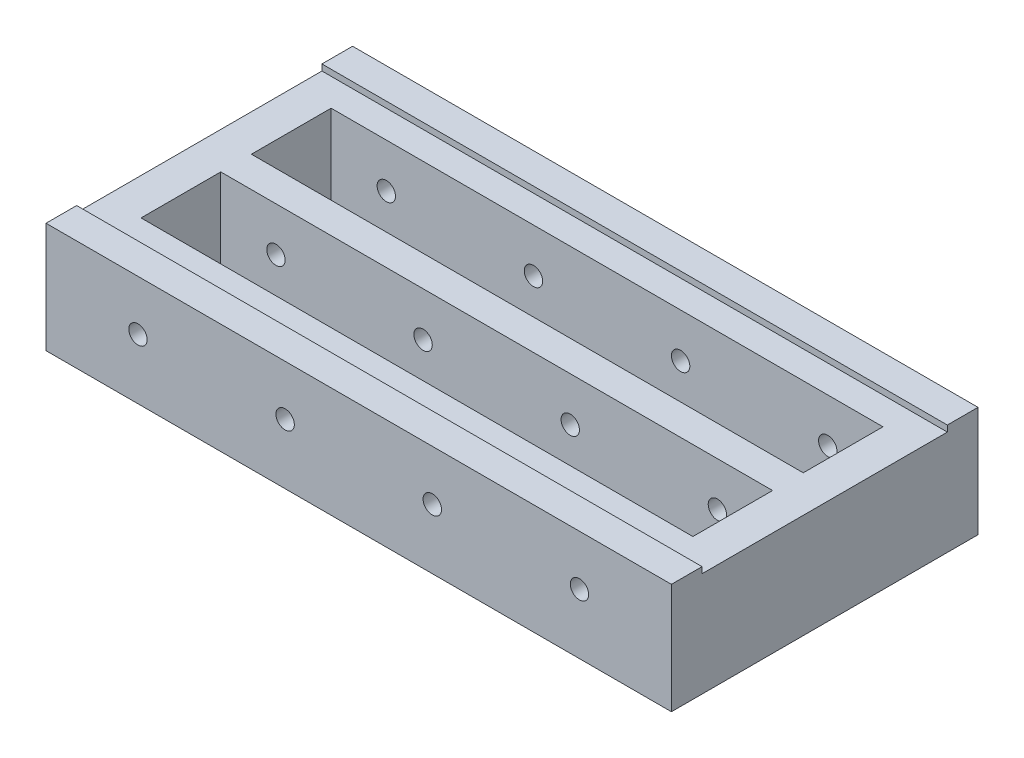
ISO-10303-21;
HEADER;
FILE_DESCRIPTION(('STEP AP214'),'2;1');
FILE_NAME('part.step','',(''),(''),'','','');
FILE_SCHEMA(('AUTOMOTIVE_DESIGN { 1 0 10303 214 1 1 1 1 }'));
ENDSEC;
DATA;
#1=APPLICATION_CONTEXT('core data for automotive mechanical design processes');
#2=APPLICATION_PROTOCOL_DEFINITION('international standard','automotive_design',2000,#1);
#3=PRODUCT_CONTEXT('',#1,'mechanical');
#4=PRODUCT('Part','Part','',(#3));
#5=PRODUCT_RELATED_PRODUCT_CATEGORY('part','',(#4));
#6=PRODUCT_DEFINITION_FORMATION('','',#4);
#7=PRODUCT_DEFINITION_CONTEXT('part definition',#1,'design');
#8=PRODUCT_DEFINITION('design','',#6,#7);
#9=PRODUCT_DEFINITION_SHAPE('','',#8);
#10=(LENGTH_UNIT() NAMED_UNIT(*) SI_UNIT(.MILLI.,.METRE.));
#11=(NAMED_UNIT(*) PLANE_ANGLE_UNIT() SI_UNIT($,.RADIAN.));
#12=(NAMED_UNIT(*) SI_UNIT($,.STERADIAN.) SOLID_ANGLE_UNIT());
#13=UNCERTAINTY_MEASURE_WITH_UNIT(LENGTH_MEASURE(1.E-05),#10,'distance_accuracy_value','');
#14=(GEOMETRIC_REPRESENTATION_CONTEXT(3) GLOBAL_UNCERTAINTY_ASSIGNED_CONTEXT((#13)) GLOBAL_UNIT_ASSIGNED_CONTEXT((#10,
#11,#12)) REPRESENTATION_CONTEXT('',''));
#15=CARTESIAN_POINT('',(0.,0.,0.));
#16=DIRECTION('',(0.,0.,1.));
#17=DIRECTION('',(1.,0.,0.));
#18=AXIS2_PLACEMENT_3D('',#15,#16,#17);
#19=CARTESIAN_POINT('',(0.,9.,0.));
#20=DIRECTION('',(0.,1.,0.));
#21=DIRECTION('',(0.,0.,1.));
#22=AXIS2_PLACEMENT_3D('',#19,#20,#21);
#23=PLANE('',#22);
#24=DIRECTION('',(-1.,0.,0.));
#25=VECTOR('',#24,1.);
#26=CARTESIAN_POINT('',(25.5,9.,-10.));
#27=LINE('',#26,#25);
#28=CARTESIAN_POINT('',(25.5,9.,-10.));
#29=VERTEX_POINT('',#28);
#30=CARTESIAN_POINT('',(-25.5,9.,-10.));
#31=VERTEX_POINT('',#30);
#32=EDGE_CURVE('E167',#29,#31,#27,.T.);
#33=ORIENTED_EDGE('',*,*,#32,.F.);
#34=DIRECTION('',(0.,0.,-1.));
#35=VECTOR('',#34,1.);
#36=CARTESIAN_POINT('',(25.5,9.,-12.5));
#37=LINE('',#36,#35);
#38=CARTESIAN_POINT('',(25.5,9.,-12.5));
#39=VERTEX_POINT('',#38);
#40=EDGE_CURVE('E243',#29,#39,#37,.T.);
#41=ORIENTED_EDGE('',*,*,#40,.T.);
#42=DIRECTION('',(-1.,0.,0.));
#43=VECTOR('',#42,1.);
#44=CARTESIAN_POINT('',(-25.5,9.,-12.5));
#45=LINE('',#44,#43);
#46=CARTESIAN_POINT('',(-25.5,9.,-12.5));
#47=VERTEX_POINT('',#46);
#48=EDGE_CURVE('E242',#39,#47,#45,.T.);
#49=ORIENTED_EDGE('',*,*,#48,.T.);
#50=DIRECTION('',(0.,0.,1.));
#51=VECTOR('',#50,1.);
#52=CARTESIAN_POINT('',(-25.5,9.,-12.5));
#53=LINE('',#52,#51);
#54=EDGE_CURVE('E245',#47,#31,#53,.T.);
#55=ORIENTED_EDGE('',*,*,#54,.T.);
#56=EDGE_LOOP('',(#33,#41,#49,#55));
#57=FACE_BOUND('',#56,.T.);
#58=ADVANCED_FACE('F40',(#57),#23,.T.);
#59=CARTESIAN_POINT('',(-22.5,9.,1.25));
#60=DIRECTION('',(1.,0.,0.));
#61=DIRECTION('',(0.,0.,-1.));
#62=AXIS2_PLACEMENT_3D('',#59,#60,#61);
#63=PLANE('',#62);
#64=DIRECTION('',(0.,-1.,0.));
#65=VECTOR('',#64,1.);
#66=CARTESIAN_POINT('',(-22.5,9.,1.25));
#67=LINE('',#66,#65);
#68=CARTESIAN_POINT('',(-22.5,8.5,1.25));
#69=VERTEX_POINT('',#68);
#70=CARTESIAN_POINT('',(-22.5,0.,1.25));
#71=VERTEX_POINT('',#70);
#72=EDGE_CURVE('E234',#69,#71,#67,.T.);
#73=ORIENTED_EDGE('',*,*,#72,.F.);
#74=DIRECTION('',(0.,0.,1.));
#75=VECTOR('',#74,1.);
#76=CARTESIAN_POINT('',(-22.5,8.5,1.25));
#77=LINE('',#76,#75);
#78=CARTESIAN_POINT('',(-22.5,8.5,7.75));
#79=VERTEX_POINT('',#78);
#80=EDGE_CURVE('E63',#69,#79,#77,.T.);
#81=ORIENTED_EDGE('',*,*,#80,.T.);
#82=DIRECTION('',(0.,-1.,0.));
#83=VECTOR('',#82,1.);
#84=CARTESIAN_POINT('',(-22.5,9.,7.75));
#85=LINE('',#84,#83);
#86=CARTESIAN_POINT('',(-22.5,0.,7.75));
#87=VERTEX_POINT('',#86);
#88=EDGE_CURVE('E236',#79,#87,#85,.T.);
#89=ORIENTED_EDGE('',*,*,#88,.T.);
#90=DIRECTION('',(0.,0.,1.));
#91=VECTOR('',#90,1.);
#92=CARTESIAN_POINT('',(-22.5,0.,1.25));
#93=LINE('',#92,#91);
#94=EDGE_CURVE('E226',#71,#87,#93,.T.);
#95=ORIENTED_EDGE('',*,*,#94,.F.);
#96=EDGE_LOOP('',(#73,#81,#89,#95));
#97=FACE_BOUND('',#96,.T.);
#98=ADVANCED_FACE('F303',(#97),#63,.T.);
#99=CARTESIAN_POINT('',(-22.5,9.,-7.75));
#100=DIRECTION('',(1.,0.,0.));
#101=DIRECTION('',(0.,0.,-1.));
#102=AXIS2_PLACEMENT_3D('',#99,#100,#101);
#103=PLANE('',#102);
#104=DIRECTION('',(0.,-1.,0.));
#105=VECTOR('',#104,1.);
#106=CARTESIAN_POINT('',(-22.5,9.,-7.75));
#107=LINE('',#106,#105);
#108=CARTESIAN_POINT('',(-22.5,8.5,-7.75));
#109=VERTEX_POINT('',#108);
#110=CARTESIAN_POINT('',(-22.5,0.,-7.75));
#111=VERTEX_POINT('',#110);
#112=EDGE_CURVE('E222',#109,#111,#107,.T.);
#113=ORIENTED_EDGE('',*,*,#112,.F.);
#114=DIRECTION('',(0.,0.,1.));
#115=VECTOR('',#114,1.);
#116=CARTESIAN_POINT('',(-22.5,8.5,-7.75));
#117=LINE('',#116,#115);
#118=CARTESIAN_POINT('',(-22.5,8.5,-1.25));
#119=VERTEX_POINT('',#118);
#120=EDGE_CURVE('E188',#109,#119,#117,.T.);
#121=ORIENTED_EDGE('',*,*,#120,.T.);
#122=DIRECTION('',(0.,-1.,0.));
#123=VECTOR('',#122,1.);
#124=CARTESIAN_POINT('',(-22.5,9.,-1.25));
#125=LINE('',#124,#123);
#126=CARTESIAN_POINT('',(-22.5,0.,-1.25));
#127=VERTEX_POINT('',#126);
#128=EDGE_CURVE('E224',#119,#127,#125,.T.);
#129=ORIENTED_EDGE('',*,*,#128,.T.);
#130=DIRECTION('',(0.,0.,1.));
#131=VECTOR('',#130,1.);
#132=CARTESIAN_POINT('',(-22.5,0.,-7.75));
#133=LINE('',#132,#131);
#134=EDGE_CURVE('E214',#111,#127,#133,.T.);
#135=ORIENTED_EDGE('',*,*,#134,.F.);
#136=EDGE_LOOP('',(#113,#121,#129,#135));
#137=FACE_BOUND('',#136,.T.);
#138=ADVANCED_FACE('F308',(#137),#103,.T.);
#139=CARTESIAN_POINT('',(13.5,9.,1.25));
#140=DIRECTION('',(0.,0.,1.));
#141=DIRECTION('',(1.,0.,0.));
#142=AXIS2_PLACEMENT_3D('',#139,#140,#141);
#143=PLANE('',#142);
#144=CARTESIAN_POINT('',(18.,4.9,1.25));
#145=DIRECTION('',(0.,0.,1.));
#146=DIRECTION('',(1.,0.,0.));
#147=AXIS2_PLACEMENT_3D('',#144,#145,#146);
#148=CIRCLE('',#147,0.750000000000002);
#149=CARTESIAN_POINT('',(18.75,4.9,1.25));
#150=VERTEX_POINT('',#149);
#151=EDGE_CURVE('E411',#150,#150,#148,.T.);
#152=ORIENTED_EDGE('',*,*,#151,.F.);
#153=EDGE_LOOP('',(#152));
#154=FACE_BOUND('',#153,.T.);
#155=DIRECTION('',(0.,-1.,0.));
#156=VECTOR('',#155,1.);
#157=CARTESIAN_POINT('',(22.5,9.,1.25));
#158=LINE('',#157,#156);
#159=CARTESIAN_POINT('',(22.5,8.5,1.25));
#160=VERTEX_POINT('',#159);
#161=CARTESIAN_POINT('',(22.5,0.,1.25));
#162=VERTEX_POINT('',#161);
#163=EDGE_CURVE('E208',#160,#162,#158,.T.);
#164=ORIENTED_EDGE('',*,*,#163,.F.);
#165=DIRECTION('',(-1.,0.,0.));
#166=VECTOR('',#165,1.);
#167=CARTESIAN_POINT('',(-22.5,8.5,1.25));
#168=LINE('',#167,#166);
#169=EDGE_CURVE('E191',#160,#69,#168,.T.);
#170=ORIENTED_EDGE('',*,*,#169,.T.);
#171=ORIENTED_EDGE('',*,*,#72,.T.);
#172=DIRECTION('',(-1.,0.,0.));
#173=VECTOR('',#172,1.);
#174=CARTESIAN_POINT('',(-22.5,0.,1.25));
#175=LINE('',#174,#173);
#176=EDGE_CURVE('E231',#162,#71,#175,.T.);
#177=ORIENTED_EDGE('',*,*,#176,.F.);
#178=EDGE_LOOP('',(#164,#170,#171,#177));
#179=FACE_BOUND('',#178,.T.);
#180=CARTESIAN_POINT('',(6.,4.9,1.25));
#181=DIRECTION('',(0.,0.,1.));
#182=DIRECTION('',(1.,0.,0.));
#183=AXIS2_PLACEMENT_3D('',#180,#181,#182);
#184=CIRCLE('',#183,0.750000000000002);
#185=CARTESIAN_POINT('',(6.75,4.9,1.25));
#186=VERTEX_POINT('',#185);
#187=EDGE_CURVE('E401',#186,#186,#184,.T.);
#188=ORIENTED_EDGE('',*,*,#187,.F.);
#189=EDGE_LOOP('',(#188));
#190=FACE_BOUND('',#189,.T.);
#191=CARTESIAN_POINT('',(-6.,4.9,1.25));
#192=DIRECTION('',(0.,0.,1.));
#193=DIRECTION('',(1.,0.,0.));
#194=AXIS2_PLACEMENT_3D('',#191,#192,#193);
#195=CIRCLE('',#194,0.750000000000002);
#196=CARTESIAN_POINT('',(-5.25,4.9,1.25));
#197=VERTEX_POINT('',#196);
#198=EDGE_CURVE('E391',#197,#197,#195,.T.);
#199=ORIENTED_EDGE('',*,*,#198,.F.);
#200=EDGE_LOOP('',(#199));
#201=FACE_BOUND('',#200,.T.);
#202=CARTESIAN_POINT('',(-18.,4.9,1.25));
#203=DIRECTION('',(0.,0.,1.));
#204=DIRECTION('',(1.,0.,0.));
#205=AXIS2_PLACEMENT_3D('',#202,#203,#204);
#206=CIRCLE('',#205,0.750000000000002);
#207=CARTESIAN_POINT('',(-17.25,4.9,1.25));
#208=VERTEX_POINT('',#207);
#209=EDGE_CURVE('E293',#208,#208,#206,.T.);
#210=ORIENTED_EDGE('',*,*,#209,.F.);
#211=EDGE_LOOP('',(#210));
#212=FACE_BOUND('',#211,.T.);
#213=ADVANCED_FACE('F344',(#154,#179,#190,#201,#212),#143,.T.);
#214=CARTESIAN_POINT('',(13.5,9.,7.75));
#215=DIRECTION('',(0.,0.,-1.));
#216=DIRECTION('',(-1.,0.,0.));
#217=AXIS2_PLACEMENT_3D('',#214,#215,#216);
#218=PLANE('',#217);
#219=CARTESIAN_POINT('',(18.,4.9,7.75));
#220=DIRECTION('',(0.,0.,-1.));
#221=DIRECTION('',(-1.,0.,0.));
#222=AXIS2_PLACEMENT_3D('',#219,#220,#221);
#223=CIRCLE('',#222,0.750000000000002);
#224=CARTESIAN_POINT('',(17.25,4.9,7.75));
#225=VERTEX_POINT('',#224);
#226=EDGE_CURVE('E414',#225,#225,#223,.T.);
#227=ORIENTED_EDGE('',*,*,#226,.F.);
#228=EDGE_LOOP('',(#227));
#229=FACE_BOUND('',#228,.T.);
#230=DIRECTION('',(0.,-1.,0.));
#231=VECTOR('',#230,1.);
#232=CARTESIAN_POINT('',(22.5,9.,7.75));
#233=LINE('',#232,#231);
#234=CARTESIAN_POINT('',(22.5,8.5,7.75));
#235=VERTEX_POINT('',#234);
#236=CARTESIAN_POINT('',(22.5,0.,7.75));
#237=VERTEX_POINT('',#236);
#238=EDGE_CURVE('E211',#235,#237,#233,.T.);
#239=ORIENTED_EDGE('',*,*,#238,.T.);
#240=DIRECTION('',(1.,0.,0.));
#241=VECTOR('',#240,1.);
#242=CARTESIAN_POINT('',(-22.5,0.,7.75));
#243=LINE('',#242,#241);
#244=EDGE_CURVE('E229',#87,#237,#243,.T.);
#245=ORIENTED_EDGE('',*,*,#244,.F.);
#246=ORIENTED_EDGE('',*,*,#88,.F.);
#247=DIRECTION('',(1.,0.,0.));
#248=VECTOR('',#247,1.);
#249=CARTESIAN_POINT('',(-22.5,8.5,7.75));
#250=LINE('',#249,#248);
#251=EDGE_CURVE('E193',#79,#235,#250,.T.);
#252=ORIENTED_EDGE('',*,*,#251,.T.);
#253=EDGE_LOOP('',(#239,#245,#246,#252));
#254=FACE_BOUND('',#253,.T.);
#255=CARTESIAN_POINT('',(6.,4.9,7.75));
#256=DIRECTION('',(0.,0.,-1.));
#257=DIRECTION('',(-1.,0.,0.));
#258=AXIS2_PLACEMENT_3D('',#255,#256,#257);
#259=CIRCLE('',#258,0.750000000000002);
#260=CARTESIAN_POINT('',(5.25,4.9,7.75));
#261=VERTEX_POINT('',#260);
#262=EDGE_CURVE('E404',#261,#261,#259,.T.);
#263=ORIENTED_EDGE('',*,*,#262,.F.);
#264=EDGE_LOOP('',(#263));
#265=FACE_BOUND('',#264,.T.);
#266=CARTESIAN_POINT('',(-6.,4.9,7.75));
#267=DIRECTION('',(0.,0.,-1.));
#268=DIRECTION('',(-1.,0.,0.));
#269=AXIS2_PLACEMENT_3D('',#266,#267,#268);
#270=CIRCLE('',#269,0.750000000000002);
#271=CARTESIAN_POINT('',(-6.75,4.9,7.75));
#272=VERTEX_POINT('',#271);
#273=EDGE_CURVE('E394',#272,#272,#270,.T.);
#274=ORIENTED_EDGE('',*,*,#273,.F.);
#275=EDGE_LOOP('',(#274));
#276=FACE_BOUND('',#275,.T.);
#277=CARTESIAN_POINT('',(-18.,4.9,7.75));
#278=DIRECTION('',(0.,0.,-1.));
#279=DIRECTION('',(-1.,0.,0.));
#280=AXIS2_PLACEMENT_3D('',#277,#278,#279);
#281=CIRCLE('',#280,0.750000000000002);
#282=CARTESIAN_POINT('',(-18.75,4.9,7.75));
#283=VERTEX_POINT('',#282);
#284=EDGE_CURVE('E289',#283,#283,#281,.T.);
#285=ORIENTED_EDGE('',*,*,#284,.F.);
#286=EDGE_LOOP('',(#285));
#287=FACE_BOUND('',#286,.T.);
#288=ADVANCED_FACE('F340',(#229,#254,#265,#276,#287),#218,.T.);
#289=CARTESIAN_POINT('',(22.5,9.,1.25));
#290=DIRECTION('',(-1.,0.,0.));
#291=DIRECTION('',(0.,0.,1.));
#292=AXIS2_PLACEMENT_3D('',#289,#290,#291);
#293=PLANE('',#292);
#294=ORIENTED_EDGE('',*,*,#238,.F.);
#295=DIRECTION('',(0.,0.,-1.));
#296=VECTOR('',#295,1.);
#297=CARTESIAN_POINT('',(22.5,8.5,1.25));
#298=LINE('',#297,#296);
#299=EDGE_CURVE('E182',#235,#160,#298,.T.);
#300=ORIENTED_EDGE('',*,*,#299,.T.);
#301=ORIENTED_EDGE('',*,*,#163,.T.);
#302=DIRECTION('',(0.,0.,-1.));
#303=VECTOR('',#302,1.);
#304=CARTESIAN_POINT('',(22.5,0.,1.25));
#305=LINE('',#304,#303);
#306=EDGE_CURVE('E205',#237,#162,#305,.T.);
#307=ORIENTED_EDGE('',*,*,#306,.F.);
#308=EDGE_LOOP('',(#294,#300,#301,#307));
#309=FACE_BOUND('',#308,.T.);
#310=ADVANCED_FACE('F336',(#309),#293,.T.);
#311=CARTESIAN_POINT('',(13.5,9.,-1.25));
#312=DIRECTION('',(0.,0.,-1.));
#313=DIRECTION('',(-1.,0.,0.));
#314=AXIS2_PLACEMENT_3D('',#311,#312,#313);
#315=PLANE('',#314);
#316=CARTESIAN_POINT('',(18.,4.9,-1.25));
#317=DIRECTION('',(0.,0.,-1.));
#318=DIRECTION('',(-1.,0.,0.));
#319=AXIS2_PLACEMENT_3D('',#316,#317,#318);
#320=CIRCLE('',#319,0.750000000000002);
#321=CARTESIAN_POINT('',(17.25,4.9,-1.25));
#322=VERTEX_POINT('',#321);
#323=EDGE_CURVE('E417',#322,#322,#320,.T.);
#324=ORIENTED_EDGE('',*,*,#323,.F.);
#325=EDGE_LOOP('',(#324));
#326=FACE_BOUND('',#325,.T.);
#327=DIRECTION('',(0.,-1.,0.));
#328=VECTOR('',#327,1.);
#329=CARTESIAN_POINT('',(22.5,9.,-1.25));
#330=LINE('',#329,#328);
#331=CARTESIAN_POINT('',(22.5,8.5,-1.25));
#332=VERTEX_POINT('',#331);
#333=CARTESIAN_POINT('',(22.5,0.,-1.25));
#334=VERTEX_POINT('',#333);
#335=EDGE_CURVE('E202',#332,#334,#330,.T.);
#336=ORIENTED_EDGE('',*,*,#335,.T.);
#337=DIRECTION('',(1.,0.,0.));
#338=VECTOR('',#337,1.);
#339=CARTESIAN_POINT('',(-22.5,0.,-1.25));
#340=LINE('',#339,#338);
#341=EDGE_CURVE('E217',#127,#334,#340,.T.);
#342=ORIENTED_EDGE('',*,*,#341,.F.);
#343=ORIENTED_EDGE('',*,*,#128,.F.);
#344=DIRECTION('',(1.,0.,0.));
#345=VECTOR('',#344,1.);
#346=CARTESIAN_POINT('',(-22.5,8.5,-1.25));
#347=LINE('',#346,#345);
#348=EDGE_CURVE('E186',#119,#332,#347,.T.);
#349=ORIENTED_EDGE('',*,*,#348,.T.);
#350=EDGE_LOOP('',(#336,#342,#343,#349));
#351=FACE_BOUND('',#350,.T.);
#352=CARTESIAN_POINT('',(6.,4.9,-1.25));
#353=DIRECTION('',(0.,0.,-1.));
#354=DIRECTION('',(-1.,0.,0.));
#355=AXIS2_PLACEMENT_3D('',#352,#353,#354);
#356=CIRCLE('',#355,0.750000000000002);
#357=CARTESIAN_POINT('',(5.25,4.9,-1.25));
#358=VERTEX_POINT('',#357);
#359=EDGE_CURVE('E369',#358,#358,#356,.T.);
#360=ORIENTED_EDGE('',*,*,#359,.F.);
#361=EDGE_LOOP('',(#360));
#362=FACE_BOUND('',#361,.T.);
#363=CARTESIAN_POINT('',(-6.,4.9,-1.25));
#364=DIRECTION('',(0.,0.,-1.));
#365=DIRECTION('',(-1.,0.,0.));
#366=AXIS2_PLACEMENT_3D('',#363,#364,#365);
#367=CIRCLE('',#366,0.750000000000002);
#368=CARTESIAN_POINT('',(-6.75,4.9,-1.25));
#369=VERTEX_POINT('',#368);
#370=EDGE_CURVE('E373',#369,#369,#367,.T.);
#371=ORIENTED_EDGE('',*,*,#370,.F.);
#372=EDGE_LOOP('',(#371));
#373=FACE_BOUND('',#372,.T.);
#374=CARTESIAN_POINT('',(-18.,4.9,-1.25));
#375=DIRECTION('',(0.,0.,-1.));
#376=DIRECTION('',(-1.,0.,0.));
#377=AXIS2_PLACEMENT_3D('',#374,#375,#376);
#378=CIRCLE('',#377,0.750000000000002);
#379=CARTESIAN_POINT('',(-18.75,4.9,-1.25));
#380=VERTEX_POINT('',#379);
#381=EDGE_CURVE('E376',#380,#380,#378,.T.);
#382=ORIENTED_EDGE('',*,*,#381,.F.);
#383=EDGE_LOOP('',(#382));
#384=FACE_BOUND('',#383,.T.);
#385=ADVANCED_FACE('F327',(#326,#351,#362,#373,#384),#315,.T.);
#386=CARTESIAN_POINT('',(22.5,9.,-7.75));
#387=DIRECTION('',(-1.,0.,0.));
#388=DIRECTION('',(0.,0.,1.));
#389=AXIS2_PLACEMENT_3D('',#386,#387,#388);
#390=PLANE('',#389);
#391=ORIENTED_EDGE('',*,*,#335,.F.);
#392=DIRECTION('',(0.,0.,-1.));
#393=VECTOR('',#392,1.);
#394=CARTESIAN_POINT('',(22.5,8.5,-7.75));
#395=LINE('',#394,#393);
#396=CARTESIAN_POINT('',(22.5,8.5,-7.75));
#397=VERTEX_POINT('',#396);
#398=EDGE_CURVE('E179',#332,#397,#395,.T.);
#399=ORIENTED_EDGE('',*,*,#398,.T.);
#400=DIRECTION('',(0.,-1.,0.));
#401=VECTOR('',#400,1.);
#402=CARTESIAN_POINT('',(22.5,9.,-7.75));
#403=LINE('',#402,#401);
#404=CARTESIAN_POINT('',(22.5,0.,-7.75));
#405=VERTEX_POINT('',#404);
#406=EDGE_CURVE('E199',#397,#405,#403,.T.);
#407=ORIENTED_EDGE('',*,*,#406,.T.);
#408=DIRECTION('',(0.,0.,-1.));
#409=VECTOR('',#408,1.);
#410=CARTESIAN_POINT('',(22.5,0.,-7.75));
#411=LINE('',#410,#409);
#412=EDGE_CURVE('E196',#334,#405,#411,.T.);
#413=ORIENTED_EDGE('',*,*,#412,.F.);
#414=EDGE_LOOP('',(#391,#399,#407,#413));
#415=FACE_BOUND('',#414,.T.);
#416=ADVANCED_FACE('F321',(#415),#390,.T.);
#417=CARTESIAN_POINT('',(13.5,9.,-7.75));
#418=DIRECTION('',(0.,0.,1.));
#419=DIRECTION('',(1.,0.,0.));
#420=AXIS2_PLACEMENT_3D('',#417,#418,#419);
#421=PLANE('',#420);
#422=CARTESIAN_POINT('',(18.,4.9,-7.75));
#423=DIRECTION('',(0.,0.,1.));
#424=DIRECTION('',(1.,0.,0.));
#425=AXIS2_PLACEMENT_3D('',#422,#423,#424);
#426=CIRCLE('',#425,0.750000000000002);
#427=CARTESIAN_POINT('',(18.75,4.9,-7.75));
#428=VERTEX_POINT('',#427);
#429=EDGE_CURVE('E420',#428,#428,#426,.T.);
#430=ORIENTED_EDGE('',*,*,#429,.F.);
#431=EDGE_LOOP('',(#430));
#432=FACE_BOUND('',#431,.T.);
#433=ORIENTED_EDGE('',*,*,#406,.F.);
#434=DIRECTION('',(-1.,0.,0.));
#435=VECTOR('',#434,1.);
#436=CARTESIAN_POINT('',(13.5,8.5,-7.75));
#437=LINE('',#436,#435);
#438=EDGE_CURVE('E11',#397,#109,#437,.T.);
#439=ORIENTED_EDGE('',*,*,#438,.T.);
#440=ORIENTED_EDGE('',*,*,#112,.T.);
#441=DIRECTION('',(-1.,0.,0.));
#442=VECTOR('',#441,1.);
#443=CARTESIAN_POINT('',(-22.5,0.,-7.75));
#444=LINE('',#443,#442);
#445=EDGE_CURVE('E219',#405,#111,#444,.T.);
#446=ORIENTED_EDGE('',*,*,#445,.F.);
#447=EDGE_LOOP('',(#433,#439,#440,#446));
#448=FACE_BOUND('',#447,.T.);
#449=CARTESIAN_POINT('',(6.,4.9,-7.75));
#450=DIRECTION('',(0.,0.,1.));
#451=DIRECTION('',(1.,0.,0.));
#452=AXIS2_PLACEMENT_3D('',#449,#450,#451);
#453=CIRCLE('',#452,0.750000000000002);
#454=CARTESIAN_POINT('',(6.75,4.9,-7.75));
#455=VERTEX_POINT('',#454);
#456=EDGE_CURVE('E408',#455,#455,#453,.T.);
#457=ORIENTED_EDGE('',*,*,#456,.F.);
#458=EDGE_LOOP('',(#457));
#459=FACE_BOUND('',#458,.T.);
#460=CARTESIAN_POINT('',(-6.,4.9,-7.75));
#461=DIRECTION('',(0.,0.,1.));
#462=DIRECTION('',(1.,0.,0.));
#463=AXIS2_PLACEMENT_3D('',#460,#461,#462);
#464=CIRCLE('',#463,0.750000000000002);
#465=CARTESIAN_POINT('',(-5.25,4.9,-7.75));
#466=VERTEX_POINT('',#465);
#467=EDGE_CURVE('E398',#466,#466,#464,.T.);
#468=ORIENTED_EDGE('',*,*,#467,.F.);
#469=EDGE_LOOP('',(#468));
#470=FACE_BOUND('',#469,.T.);
#471=CARTESIAN_POINT('',(-18.,4.9,-7.75));
#472=DIRECTION('',(0.,0.,1.));
#473=DIRECTION('',(1.,0.,0.));
#474=AXIS2_PLACEMENT_3D('',#471,#472,#473);
#475=CIRCLE('',#474,0.750000000000002);
#476=CARTESIAN_POINT('',(-17.25,4.9,-7.75));
#477=VERTEX_POINT('',#476);
#478=EDGE_CURVE('E378',#477,#477,#475,.T.);
#479=ORIENTED_EDGE('',*,*,#478,.F.);
#480=EDGE_LOOP('',(#479));
#481=FACE_BOUND('',#480,.T.);
#482=ADVANCED_FACE('F313',(#432,#448,#459,#470,#481),#421,.T.);
#483=DIRECTION('',(1.,0.,0.));
#484=VECTOR('',#483,1.);
#485=CARTESIAN_POINT('',(25.5,9.,10.));
#486=LINE('',#485,#484);
#487=CARTESIAN_POINT('',(-25.5,9.,10.));
#488=VERTEX_POINT('',#487);
#489=CARTESIAN_POINT('',(25.5,9.,10.));
#490=VERTEX_POINT('',#489);
#491=EDGE_CURVE('E288',#488,#490,#486,.T.);
#492=ORIENTED_EDGE('',*,*,#491,.F.);
#493=CARTESIAN_POINT('',(-25.5,9.,12.5));
#494=VERTEX_POINT('',#493);
#495=EDGE_CURVE('E172',#488,#494,#53,.T.);
#496=ORIENTED_EDGE('',*,*,#495,.T.);
#497=DIRECTION('',(1.,0.,0.));
#498=VECTOR('',#497,1.);
#499=CARTESIAN_POINT('',(-25.5,9.,12.5));
#500=LINE('',#499,#498);
#501=CARTESIAN_POINT('',(25.5,9.,12.5));
#502=VERTEX_POINT('',#501);
#503=EDGE_CURVE('E248',#494,#502,#500,.T.);
#504=ORIENTED_EDGE('',*,*,#503,.T.);
#505=EDGE_CURVE('E239',#502,#490,#37,.T.);
#506=ORIENTED_EDGE('',*,*,#505,.T.);
#507=EDGE_LOOP('',(#492,#496,#504,#506));
#508=FACE_BOUND('',#507,.T.);
#509=ADVANCED_FACE('F287',(#508),#23,.T.);
#510=CARTESIAN_POINT('',(0.,0.,0.));
#511=DIRECTION('',(0.,1.,0.));
#512=DIRECTION('',(0.,0.,1.));
#513=AXIS2_PLACEMENT_3D('',#510,#511,#512);
#514=PLANE('',#513);
#515=ORIENTED_EDGE('',*,*,#244,.T.);
#516=ORIENTED_EDGE('',*,*,#306,.T.);
#517=ORIENTED_EDGE('',*,*,#176,.T.);
#518=ORIENTED_EDGE('',*,*,#94,.T.);
#519=EDGE_LOOP('',(#515,#516,#517,#518));
#520=FACE_BOUND('',#519,.T.);
#521=DIRECTION('',(0.,0.,-1.));
#522=VECTOR('',#521,1.);
#523=CARTESIAN_POINT('',(25.5,0.,-12.5));
#524=LINE('',#523,#522);
#525=CARTESIAN_POINT('',(25.5,0.,12.5));
#526=VERTEX_POINT('',#525);
#527=CARTESIAN_POINT('',(25.5,0.,-12.5));
#528=VERTEX_POINT('',#527);
#529=EDGE_CURVE('E238',#526,#528,#524,.T.);
#530=ORIENTED_EDGE('',*,*,#529,.F.);
#531=DIRECTION('',(1.,0.,0.));
#532=VECTOR('',#531,1.);
#533=CARTESIAN_POINT('',(-25.5,0.,12.5));
#534=LINE('',#533,#532);
#535=CARTESIAN_POINT('',(-25.5,0.,12.5));
#536=VERTEX_POINT('',#535);
#537=EDGE_CURVE('E257',#536,#526,#534,.T.);
#538=ORIENTED_EDGE('',*,*,#537,.F.);
#539=DIRECTION('',(0.,0.,1.));
#540=VECTOR('',#539,1.);
#541=CARTESIAN_POINT('',(-25.5,0.,-12.5));
#542=LINE('',#541,#540);
#543=CARTESIAN_POINT('',(-25.5,0.,-12.5));
#544=VERTEX_POINT('',#543);
#545=EDGE_CURVE('E255',#544,#536,#542,.T.);
#546=ORIENTED_EDGE('',*,*,#545,.F.);
#547=DIRECTION('',(-1.,0.,0.));
#548=VECTOR('',#547,1.);
#549=CARTESIAN_POINT('',(-25.5,0.,-12.5));
#550=LINE('',#549,#548);
#551=EDGE_CURVE('E253',#528,#544,#550,.T.);
#552=ORIENTED_EDGE('',*,*,#551,.F.);
#553=EDGE_LOOP('',(#530,#538,#546,#552));
#554=FACE_BOUND('',#553,.T.);
#555=ORIENTED_EDGE('',*,*,#412,.T.);
#556=ORIENTED_EDGE('',*,*,#445,.T.);
#557=ORIENTED_EDGE('',*,*,#134,.T.);
#558=ORIENTED_EDGE('',*,*,#341,.T.);
#559=EDGE_LOOP('',(#555,#556,#557,#558));
#560=FACE_BOUND('',#559,.T.);
#561=ADVANCED_FACE('F279',(#520,#554,#560),#514,.F.);
#562=CARTESIAN_POINT('',(25.5,9.,-12.5));
#563=DIRECTION('',(-1.,0.,0.));
#564=DIRECTION('',(0.,0.,1.));
#565=AXIS2_PLACEMENT_3D('',#562,#563,#564);
#566=PLANE('',#565);
#567=ORIENTED_EDGE('',*,*,#40,.F.);
#568=DIRECTION('',(0.,1.,0.));
#569=VECTOR('',#568,1.);
#570=CARTESIAN_POINT('',(25.5,8.5,-10.));
#571=LINE('',#570,#569);
#572=CARTESIAN_POINT('',(25.5,8.5,-10.));
#573=VERTEX_POINT('',#572);
#574=EDGE_CURVE('E174',#573,#29,#571,.T.);
#575=ORIENTED_EDGE('',*,*,#574,.F.);
#576=DIRECTION('',(0.,0.,-1.));
#577=VECTOR('',#576,1.);
#578=CARTESIAN_POINT('',(25.5,8.5,10.));
#579=LINE('',#578,#577);
#580=CARTESIAN_POINT('',(25.5,8.5,10.));
#581=VERTEX_POINT('',#580);
#582=EDGE_CURVE('E160',#581,#573,#579,.T.);
#583=ORIENTED_EDGE('',*,*,#582,.F.);
#584=DIRECTION('',(0.,1.,0.));
#585=VECTOR('',#584,1.);
#586=CARTESIAN_POINT('',(25.5,8.5,10.));
#587=LINE('',#586,#585);
#588=EDGE_CURVE('E158',#581,#490,#587,.T.);
#589=ORIENTED_EDGE('',*,*,#588,.T.);
#590=ORIENTED_EDGE('',*,*,#505,.F.);
#591=DIRECTION('',(0.,-1.,0.));
#592=VECTOR('',#591,1.);
#593=CARTESIAN_POINT('',(25.5,9.,12.5));
#594=LINE('',#593,#592);
#595=EDGE_CURVE('E250',#502,#526,#594,.T.);
#596=ORIENTED_EDGE('',*,*,#595,.T.);
#597=ORIENTED_EDGE('',*,*,#529,.T.);
#598=DIRECTION('',(0.,-1.,0.));
#599=VECTOR('',#598,1.);
#600=CARTESIAN_POINT('',(25.5,9.,-12.5));
#601=LINE('',#600,#599);
#602=EDGE_CURVE('E48',#39,#528,#601,.T.);
#603=ORIENTED_EDGE('',*,*,#602,.F.);
#604=EDGE_LOOP('',(#567,#575,#583,#589,#590,#596,#597,#603));
#605=FACE_BOUND('',#604,.T.);
#606=ADVANCED_FACE('F42',(#605),#566,.F.);
#607=CARTESIAN_POINT('',(-25.5,9.,-12.5));
#608=DIRECTION('',(0.,0.,1.));
#609=DIRECTION('',(1.,0.,0.));
#610=AXIS2_PLACEMENT_3D('',#607,#608,#609);
#611=PLANE('',#610);
#612=CARTESIAN_POINT('',(-6.,4.9,-12.5));
#613=DIRECTION('',(0.,0.,1.));
#614=DIRECTION('',(1.,0.,0.));
#615=AXIS2_PLACEMENT_3D('',#612,#613,#614);
#616=CIRCLE('',#615,0.750000000000002);
#617=CARTESIAN_POINT('',(-5.25,4.9,-12.5));
#618=VERTEX_POINT('',#617);
#619=EDGE_CURVE('E423',#618,#618,#616,.T.);
#620=ORIENTED_EDGE('',*,*,#619,.T.);
#621=EDGE_LOOP('',(#620));
#622=FACE_BOUND('',#621,.T.);
#623=CARTESIAN_POINT('',(6.,4.9,-12.5));
#624=DIRECTION('',(0.,0.,1.));
#625=DIRECTION('',(1.,0.,0.));
#626=AXIS2_PLACEMENT_3D('',#623,#624,#625);
#627=CIRCLE('',#626,0.750000000000002);
#628=CARTESIAN_POINT('',(6.75,4.9,-12.5));
#629=VERTEX_POINT('',#628);
#630=EDGE_CURVE('E431',#629,#629,#627,.T.);
#631=ORIENTED_EDGE('',*,*,#630,.T.);
#632=EDGE_LOOP('',(#631));
#633=FACE_BOUND('',#632,.T.);
#634=CARTESIAN_POINT('',(18.,4.9,-12.5));
#635=DIRECTION('',(0.,0.,1.));
#636=DIRECTION('',(1.,0.,0.));
#637=AXIS2_PLACEMENT_3D('',#634,#635,#636);
#638=CIRCLE('',#637,0.750000000000002);
#639=CARTESIAN_POINT('',(18.75,4.9,-12.5));
#640=VERTEX_POINT('',#639);
#641=EDGE_CURVE('E424',#640,#640,#638,.T.);
#642=ORIENTED_EDGE('',*,*,#641,.T.);
#643=EDGE_LOOP('',(#642));
#644=FACE_BOUND('',#643,.T.);
#645=CARTESIAN_POINT('',(-18.,4.9,-12.5));
#646=DIRECTION('',(0.,0.,1.));
#647=DIRECTION('',(1.,0.,0.));
#648=AXIS2_PLACEMENT_3D('',#645,#646,#647);
#649=CIRCLE('',#648,0.750000000000002);
#650=CARTESIAN_POINT('',(-17.25,4.9,-12.5));
#651=VERTEX_POINT('',#650);
#652=EDGE_CURVE('E383',#651,#651,#649,.T.);
#653=ORIENTED_EDGE('',*,*,#652,.T.);
#654=EDGE_LOOP('',(#653));
#655=FACE_BOUND('',#654,.T.);
#656=ORIENTED_EDGE('',*,*,#551,.T.);
#657=DIRECTION('',(0.,-1.,0.));
#658=VECTOR('',#657,1.);
#659=CARTESIAN_POINT('',(-25.5,9.,-12.5));
#660=LINE('',#659,#658);
#661=EDGE_CURVE('E264',#47,#544,#660,.T.);
#662=ORIENTED_EDGE('',*,*,#661,.F.);
#663=ORIENTED_EDGE('',*,*,#48,.F.);
#664=ORIENTED_EDGE('',*,*,#602,.T.);
#665=EDGE_LOOP('',(#656,#662,#663,#664));
#666=FACE_BOUND('',#665,.T.);
#667=ADVANCED_FACE('F270',(#622,#633,#644,#655,#666),#611,.F.);
#668=CARTESIAN_POINT('',(-25.5,9.,-12.5));
#669=DIRECTION('',(1.,0.,0.));
#670=DIRECTION('',(0.,0.,-1.));
#671=AXIS2_PLACEMENT_3D('',#668,#669,#670);
#672=PLANE('',#671);
#673=DIRECTION('',(0.,0.,1.));
#674=VECTOR('',#673,1.);
#675=CARTESIAN_POINT('',(-25.5,8.5,10.));
#676=LINE('',#675,#674);
#677=CARTESIAN_POINT('',(-25.5,8.5,-10.));
#678=VERTEX_POINT('',#677);
#679=CARTESIAN_POINT('',(-25.5,8.5,10.));
#680=VERTEX_POINT('',#679);
#681=EDGE_CURVE('E161',#678,#680,#676,.T.);
#682=ORIENTED_EDGE('',*,*,#681,.F.);
#683=DIRECTION('',(0.,1.,0.));
#684=VECTOR('',#683,1.);
#685=CARTESIAN_POINT('',(-25.5,8.5,-10.));
#686=LINE('',#685,#684);
#687=EDGE_CURVE('E183',#678,#31,#686,.T.);
#688=ORIENTED_EDGE('',*,*,#687,.T.);
#689=ORIENTED_EDGE('',*,*,#54,.F.);
#690=ORIENTED_EDGE('',*,*,#661,.T.);
#691=ORIENTED_EDGE('',*,*,#545,.T.);
#692=DIRECTION('',(0.,-1.,0.));
#693=VECTOR('',#692,1.);
#694=CARTESIAN_POINT('',(-25.5,9.,12.5));
#695=LINE('',#694,#693);
#696=EDGE_CURVE('E261',#494,#536,#695,.T.);
#697=ORIENTED_EDGE('',*,*,#696,.F.);
#698=ORIENTED_EDGE('',*,*,#495,.F.);
#699=DIRECTION('',(0.,1.,0.));
#700=VECTOR('',#699,1.);
#701=CARTESIAN_POINT('',(-25.5,8.5,10.));
#702=LINE('',#701,#700);
#703=EDGE_CURVE('E155',#680,#488,#702,.T.);
#704=ORIENTED_EDGE('',*,*,#703,.F.);
#705=EDGE_LOOP('',(#682,#688,#689,#690,#691,#697,#698,#704));
#706=FACE_BOUND('',#705,.T.);
#707=ADVANCED_FACE('F170',(#706),#672,.F.);
#708=CARTESIAN_POINT('',(-25.5,9.,12.5));
#709=DIRECTION('',(0.,0.,-1.));
#710=DIRECTION('',(-1.,0.,0.));
#711=AXIS2_PLACEMENT_3D('',#708,#709,#710);
#712=PLANE('',#711);
#713=CARTESIAN_POINT('',(-6.,4.9,12.5));
#714=DIRECTION('',(0.,0.,1.));
#715=DIRECTION('',(1.,0.,0.));
#716=AXIS2_PLACEMENT_3D('',#713,#714,#715);
#717=CIRCLE('',#716,0.750000000000002);
#718=CARTESIAN_POINT('',(-5.25,4.9,12.5));
#719=VERTEX_POINT('',#718);
#720=EDGE_CURVE('E434',#719,#719,#717,.T.);
#721=ORIENTED_EDGE('',*,*,#720,.F.);
#722=EDGE_LOOP('',(#721));
#723=FACE_BOUND('',#722,.T.);
#724=CARTESIAN_POINT('',(6.,4.9,12.5));
#725=DIRECTION('',(0.,0.,1.));
#726=DIRECTION('',(1.,0.,0.));
#727=AXIS2_PLACEMENT_3D('',#724,#725,#726);
#728=CIRCLE('',#727,0.750000000000002);
#729=CARTESIAN_POINT('',(6.75,4.9,12.5));
#730=VERTEX_POINT('',#729);
#731=EDGE_CURVE('E427',#730,#730,#728,.T.);
#732=ORIENTED_EDGE('',*,*,#731,.F.);
#733=EDGE_LOOP('',(#732));
#734=FACE_BOUND('',#733,.T.);
#735=CARTESIAN_POINT('',(18.,4.9,12.5));
#736=DIRECTION('',(0.,0.,1.));
#737=DIRECTION('',(1.,0.,0.));
#738=AXIS2_PLACEMENT_3D('',#735,#736,#737);
#739=CIRCLE('',#738,0.750000000000002);
#740=CARTESIAN_POINT('',(18.75,4.9,12.5));
#741=VERTEX_POINT('',#740);
#742=EDGE_CURVE('E428',#741,#741,#739,.T.);
#743=ORIENTED_EDGE('',*,*,#742,.F.);
#744=EDGE_LOOP('',(#743));
#745=FACE_BOUND('',#744,.T.);
#746=CARTESIAN_POINT('',(-18.,4.9,12.5));
#747=DIRECTION('',(0.,0.,1.));
#748=DIRECTION('',(1.,0.,0.));
#749=AXIS2_PLACEMENT_3D('',#746,#747,#748);
#750=CIRCLE('',#749,0.750000000000002);
#751=CARTESIAN_POINT('',(-17.25,4.9,12.5));
#752=VERTEX_POINT('',#751);
#753=EDGE_CURVE('E388',#752,#752,#750,.T.);
#754=ORIENTED_EDGE('',*,*,#753,.F.);
#755=EDGE_LOOP('',(#754));
#756=FACE_BOUND('',#755,.T.);
#757=ORIENTED_EDGE('',*,*,#537,.T.);
#758=ORIENTED_EDGE('',*,*,#595,.F.);
#759=ORIENTED_EDGE('',*,*,#503,.F.);
#760=ORIENTED_EDGE('',*,*,#696,.T.);
#761=EDGE_LOOP('',(#757,#758,#759,#760));
#762=FACE_BOUND('',#761,.T.);
#763=ADVANCED_FACE('F285',(#723,#734,#745,#756,#762),#712,.F.);
#764=CARTESIAN_POINT('',(25.5,8.5,-10.));
#765=DIRECTION('',(0.,0.,-1.));
#766=DIRECTION('',(-1.,0.,0.));
#767=AXIS2_PLACEMENT_3D('',#764,#765,#766);
#768=PLANE('',#767);
#769=ORIENTED_EDGE('',*,*,#32,.T.);
#770=ORIENTED_EDGE('',*,*,#687,.F.);
#771=DIRECTION('',(-1.,0.,0.));
#772=VECTOR('',#771,1.);
#773=CARTESIAN_POINT('',(25.5,8.5,-10.));
#774=LINE('',#773,#772);
#775=EDGE_CURVE('E55',#573,#678,#774,.T.);
#776=ORIENTED_EDGE('',*,*,#775,.F.);
#777=ORIENTED_EDGE('',*,*,#574,.T.);
#778=EDGE_LOOP('',(#769,#770,#776,#777));
#779=FACE_BOUND('',#778,.T.);
#780=ADVANCED_FACE('F300',(#779),#768,.F.);
#781=CARTESIAN_POINT('',(25.5,8.5,10.));
#782=DIRECTION('',(0.,0.,1.));
#783=DIRECTION('',(1.,0.,0.));
#784=AXIS2_PLACEMENT_3D('',#781,#782,#783);
#785=PLANE('',#784);
#786=ORIENTED_EDGE('',*,*,#491,.T.);
#787=ORIENTED_EDGE('',*,*,#588,.F.);
#788=DIRECTION('',(1.,0.,0.));
#789=VECTOR('',#788,1.);
#790=CARTESIAN_POINT('',(25.5,8.5,10.));
#791=LINE('',#790,#789);
#792=EDGE_CURVE('E152',#680,#581,#791,.T.);
#793=ORIENTED_EDGE('',*,*,#792,.F.);
#794=ORIENTED_EDGE('',*,*,#703,.T.);
#795=EDGE_LOOP('',(#786,#787,#793,#794));
#796=FACE_BOUND('',#795,.T.);
#797=ADVANCED_FACE('F153',(#796),#785,.F.);
#798=CARTESIAN_POINT('',(0.,8.5,0.));
#799=DIRECTION('',(0.,1.,0.));
#800=DIRECTION('',(0.,0.,1.));
#801=AXIS2_PLACEMENT_3D('',#798,#799,#800);
#802=PLANE('',#801);
#803=ORIENTED_EDGE('',*,*,#120,.F.);
#804=ORIENTED_EDGE('',*,*,#438,.F.);
#805=ORIENTED_EDGE('',*,*,#398,.F.);
#806=ORIENTED_EDGE('',*,*,#348,.F.);
#807=EDGE_LOOP('',(#803,#804,#805,#806));
#808=FACE_BOUND('',#807,.T.);
#809=ORIENTED_EDGE('',*,*,#299,.F.);
#810=ORIENTED_EDGE('',*,*,#251,.F.);
#811=ORIENTED_EDGE('',*,*,#80,.F.);
#812=ORIENTED_EDGE('',*,*,#169,.F.);
#813=EDGE_LOOP('',(#809,#810,#811,#812));
#814=FACE_BOUND('',#813,.T.);
#815=ORIENTED_EDGE('',*,*,#681,.T.);
#816=ORIENTED_EDGE('',*,*,#792,.T.);
#817=ORIENTED_EDGE('',*,*,#582,.T.);
#818=ORIENTED_EDGE('',*,*,#775,.T.);
#819=EDGE_LOOP('',(#815,#816,#817,#818));
#820=FACE_BOUND('',#819,.T.);
#821=ADVANCED_FACE('F164',(#808,#814,#820),#802,.T.);
#822=CARTESIAN_POINT('',(-18.,4.9,-12.5));
#823=DIRECTION('',(0.,0.,1.));
#824=DIRECTION('',(1.,0.,0.));
#825=AXIS2_PLACEMENT_3D('',#822,#823,#824);
#826=CYLINDRICAL_SURFACE('',#825,0.750000000000002);
#827=ORIENTED_EDGE('',*,*,#284,.T.);
#828=EDGE_LOOP('',(#827));
#829=FACE_BOUND('',#828,.T.);
#830=ORIENTED_EDGE('',*,*,#753,.T.);
#831=EDGE_LOOP('',(#830));
#832=FACE_BOUND('',#831,.T.);
#833=ADVANCED_FACE('F453',(#829,#832),#826,.F.);
#834=ORIENTED_EDGE('',*,*,#478,.T.);
#835=EDGE_LOOP('',(#834));
#836=FACE_BOUND('',#835,.T.);
#837=ORIENTED_EDGE('',*,*,#652,.F.);
#838=EDGE_LOOP('',(#837));
#839=FACE_BOUND('',#838,.T.);
#840=ADVANCED_FACE('F455',(#836,#839),#826,.F.);
#841=ORIENTED_EDGE('',*,*,#209,.T.);
#842=EDGE_LOOP('',(#841));
#843=FACE_BOUND('',#842,.T.);
#844=ORIENTED_EDGE('',*,*,#381,.T.);
#845=EDGE_LOOP('',(#844));
#846=FACE_BOUND('',#845,.T.);
#847=ADVANCED_FACE('F458',(#843,#846),#826,.F.);
#848=CARTESIAN_POINT('',(18.,4.9,-12.5));
#849=DIRECTION('',(0.,0.,1.));
#850=DIRECTION('',(1.,0.,0.));
#851=AXIS2_PLACEMENT_3D('',#848,#849,#850);
#852=CYLINDRICAL_SURFACE('',#851,0.750000000000002);
#853=ORIENTED_EDGE('',*,*,#226,.T.);
#854=EDGE_LOOP('',(#853));
#855=FACE_BOUND('',#854,.T.);
#856=ORIENTED_EDGE('',*,*,#742,.T.);
#857=EDGE_LOOP('',(#856));
#858=FACE_BOUND('',#857,.T.);
#859=ADVANCED_FACE('F468',(#855,#858),#852,.F.);
#860=CARTESIAN_POINT('',(6.,4.9,-12.5));
#861=DIRECTION('',(0.,0.,1.));
#862=DIRECTION('',(1.,0.,0.));
#863=AXIS2_PLACEMENT_3D('',#860,#861,#862);
#864=CYLINDRICAL_SURFACE('',#863,0.750000000000002);
#865=ORIENTED_EDGE('',*,*,#262,.T.);
#866=EDGE_LOOP('',(#865));
#867=FACE_BOUND('',#866,.T.);
#868=ORIENTED_EDGE('',*,*,#731,.T.);
#869=EDGE_LOOP('',(#868));
#870=FACE_BOUND('',#869,.T.);
#871=ADVANCED_FACE('F473',(#867,#870),#864,.F.);
#872=CARTESIAN_POINT('',(-6.,4.9,-12.5));
#873=DIRECTION('',(0.,0.,1.));
#874=DIRECTION('',(1.,0.,0.));
#875=AXIS2_PLACEMENT_3D('',#872,#873,#874);
#876=CYLINDRICAL_SURFACE('',#875,0.750000000000002);
#877=ORIENTED_EDGE('',*,*,#273,.T.);
#878=EDGE_LOOP('',(#877));
#879=FACE_BOUND('',#878,.T.);
#880=ORIENTED_EDGE('',*,*,#720,.T.);
#881=EDGE_LOOP('',(#880));
#882=FACE_BOUND('',#881,.T.);
#883=ADVANCED_FACE('F442',(#879,#882),#876,.F.);
#884=ORIENTED_EDGE('',*,*,#429,.T.);
#885=EDGE_LOOP('',(#884));
#886=FACE_BOUND('',#885,.T.);
#887=ORIENTED_EDGE('',*,*,#641,.F.);
#888=EDGE_LOOP('',(#887));
#889=FACE_BOUND('',#888,.T.);
#890=ADVANCED_FACE('F475',(#886,#889),#852,.F.);
#891=ORIENTED_EDGE('',*,*,#456,.T.);
#892=EDGE_LOOP('',(#891));
#893=FACE_BOUND('',#892,.T.);
#894=ORIENTED_EDGE('',*,*,#630,.F.);
#895=EDGE_LOOP('',(#894));
#896=FACE_BOUND('',#895,.T.);
#897=ADVANCED_FACE('F484',(#893,#896),#864,.F.);
#898=ORIENTED_EDGE('',*,*,#467,.T.);
#899=EDGE_LOOP('',(#898));
#900=FACE_BOUND('',#899,.T.);
#901=ORIENTED_EDGE('',*,*,#619,.F.);
#902=EDGE_LOOP('',(#901));
#903=FACE_BOUND('',#902,.T.);
#904=ADVANCED_FACE('F490',(#900,#903),#876,.F.);
#905=ORIENTED_EDGE('',*,*,#151,.T.);
#906=EDGE_LOOP('',(#905));
#907=FACE_BOUND('',#906,.T.);
#908=ORIENTED_EDGE('',*,*,#323,.T.);
#909=EDGE_LOOP('',(#908));
#910=FACE_BOUND('',#909,.T.);
#911=ADVANCED_FACE('F476',(#907,#910),#852,.F.);
#912=ORIENTED_EDGE('',*,*,#187,.T.);
#913=EDGE_LOOP('',(#912));
#914=FACE_BOUND('',#913,.T.);
#915=ORIENTED_EDGE('',*,*,#359,.T.);
#916=EDGE_LOOP('',(#915));
#917=FACE_BOUND('',#916,.T.);
#918=ADVANCED_FACE('F485',(#914,#917),#864,.F.);
#919=ORIENTED_EDGE('',*,*,#198,.T.);
#920=EDGE_LOOP('',(#919));
#921=FACE_BOUND('',#920,.T.);
#922=ORIENTED_EDGE('',*,*,#370,.T.);
#923=EDGE_LOOP('',(#922));
#924=FACE_BOUND('',#923,.T.);
#925=ADVANCED_FACE('F496',(#921,#924),#876,.F.);
#926=CLOSED_SHELL('',(#58,#98,#138,#213,#288,#310,#385,#416,#482,#509,#561,#606,#667,#707,#763,
#780,#797,#821,#833,#840,#847,#859,#871,#883,#890,#897,#904,#911,#918,#925));
#927=MANIFOLD_SOLID_BREP('B2',#926);
#928=ADVANCED_BREP_SHAPE_REPRESENTATION('',(#18,#927),#14);
#929=SHAPE_DEFINITION_REPRESENTATION(#9,#928);
ENDSEC;
END-ISO-10303-21;
